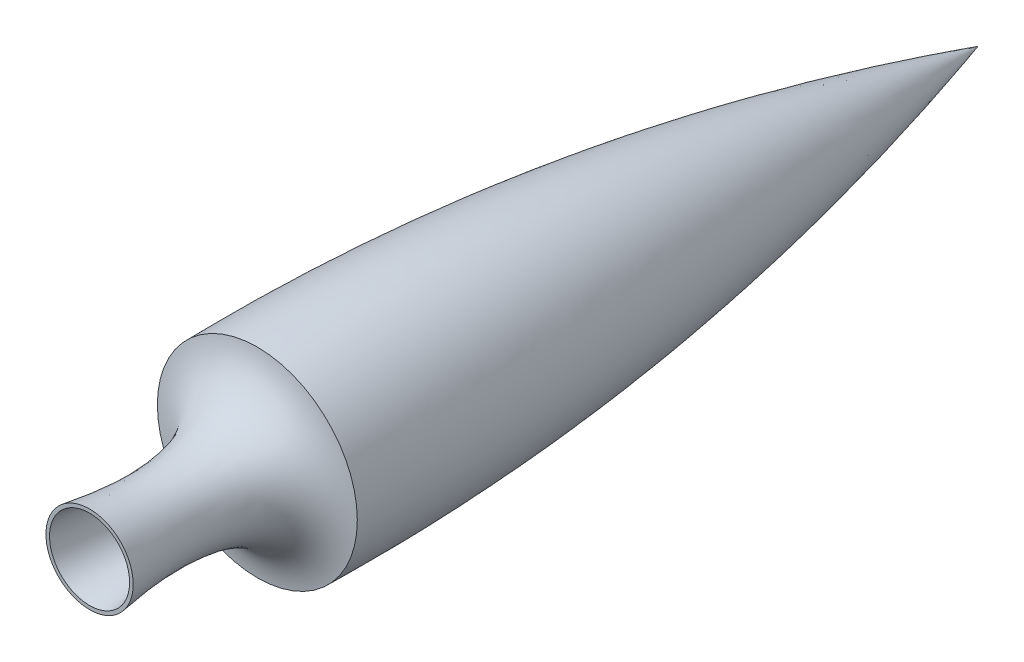
ISO-10303-21;
HEADER;
FILE_DESCRIPTION(('STEP AP214'),'2;1');
FILE_NAME('part.step','',(''),(''),'','','');
FILE_SCHEMA(('AUTOMOTIVE_DESIGN { 1 0 10303 214 1 1 1 1 }'));
ENDSEC;
DATA;
#1=APPLICATION_CONTEXT('core data for automotive mechanical design processes');
#2=APPLICATION_PROTOCOL_DEFINITION('international standard','automotive_design',2000,#1);
#3=PRODUCT_CONTEXT('',#1,'mechanical');
#4=PRODUCT('Part','Part','',(#3));
#5=PRODUCT_RELATED_PRODUCT_CATEGORY('part','',(#4));
#6=PRODUCT_DEFINITION_FORMATION('','',#4);
#7=PRODUCT_DEFINITION_CONTEXT('part definition',#1,'design');
#8=PRODUCT_DEFINITION('design','',#6,#7);
#9=PRODUCT_DEFINITION_SHAPE('','',#8);
#10=(LENGTH_UNIT() NAMED_UNIT(*) SI_UNIT(.MILLI.,.METRE.));
#11=(NAMED_UNIT(*) PLANE_ANGLE_UNIT() SI_UNIT($,.RADIAN.));
#12=(NAMED_UNIT(*) SI_UNIT($,.STERADIAN.) SOLID_ANGLE_UNIT());
#13=UNCERTAINTY_MEASURE_WITH_UNIT(LENGTH_MEASURE(1.E-05),#10,'distance_accuracy_value','');
#14=(GEOMETRIC_REPRESENTATION_CONTEXT(3) GLOBAL_UNCERTAINTY_ASSIGNED_CONTEXT((#13)) GLOBAL_UNIT_ASSIGNED_CONTEXT((#10,
#11,#12)) REPRESENTATION_CONTEXT('',''));
#15=CARTESIAN_POINT('',(0.,0.,0.));
#16=DIRECTION('',(0.,0.,1.));
#17=DIRECTION('',(1.,0.,0.));
#18=AXIS2_PLACEMENT_3D('',#15,#16,#17);
#19=CARTESIAN_POINT('',(2250.27394670477,0.,7226.5861874133));
#20=CARTESIAN_POINT('',(2376.04805744027,0.,-966.497350289462));
#21=CARTESIAN_POINT('',(0.,0.,-8996.49636521877));
#22=B_SPLINE_CURVE_WITH_KNOTS('',2,(#19,#20,#21),.UNSPECIFIED.,.F.,.F.,(3,3),(0.,1.),.UNSPECIFIED.);
#23=CARTESIAN_POINT('',(0.,0.,11003.5036347812));
#24=DIRECTION('',(0.,0.,1.));
#25=AXIS1_PLACEMENT('',#23,#24);
#26=SURFACE_OF_REVOLUTION('',#22,#25);
#27=CARTESIAN_POINT('',(0.,0.,-8996.49636521877));
#28=VERTEX_POINT('',#27);
#29=VERTEX_LOOP('',#28);
#30=FACE_BOUND('',#29,.T.);
#31=CARTESIAN_POINT('',(0.,0.,7226.5861874133));
#32=DIRECTION('',(0.,0.,1.));
#33=DIRECTION('',(1.,0.,0.));
#34=AXIS2_PLACEMENT_3D('',#31,#32,#33);
#35=CIRCLE('',#34,2250.27394670477);
#36=CARTESIAN_POINT('',(2250.27394670477,0.,7226.5861874133));
#37=VERTEX_POINT('',#36);
#38=EDGE_CURVE('E41',#37,#37,#35,.T.);
#39=ORIENTED_EDGE('',*,*,#38,.F.);
#40=EDGE_LOOP('',(#39));
#41=FACE_BOUND('',#40,.T.);
#42=ADVANCED_FACE('F33',(#30,#41),#26,.F.);
#43=CARTESIAN_POINT('',(982.337967225178,0.,11003.5036347812));
#44=DIRECTION('',(0.,0.,1.));
#45=DIRECTION('',(1.,0.,0.));
#46=AXIS2_PLACEMENT_3D('',#43,#44,#45);
#47=PLANE('',#46);
#48=CARTESIAN_POINT('',(0.,0.,11003.5036347812));
#49=DIRECTION('',(0.,0.,1.));
#50=DIRECTION('',(1.,0.,0.));
#51=AXIS2_PLACEMENT_3D('',#48,#49,#50);
#52=CIRCLE('',#51,901.370388322169);
#53=CARTESIAN_POINT('',(901.370388322169,0.,11003.5036347812));
#54=VERTEX_POINT('',#53);
#55=EDGE_CURVE('E57',#54,#54,#52,.T.);
#56=ORIENTED_EDGE('',*,*,#55,.F.);
#57=EDGE_LOOP('',(#56));
#58=FACE_BOUND('',#57,.T.);
#59=CARTESIAN_POINT('',(0.,0.,11003.5036347812));
#60=DIRECTION('',(0.,0.,1.));
#61=DIRECTION('',(1.,0.,0.));
#62=AXIS2_PLACEMENT_3D('',#59,#60,#61);
#63=CIRCLE('',#62,982.337967225178);
#64=CARTESIAN_POINT('',(982.337967225178,0.,11003.5036347812));
#65=VERTEX_POINT('',#64);
#66=EDGE_CURVE('E11',#65,#65,#63,.T.);
#67=ORIENTED_EDGE('',*,*,#66,.T.);
#68=EDGE_LOOP('',(#67));
#69=FACE_BOUND('',#68,.T.);
#70=ADVANCED_FACE('F79',(#58,#69),#47,.T.);
#71=CARTESIAN_POINT('',(982.337967225178,0.,11003.5036347812));
#72=CARTESIAN_POINT('',(428.443970137698,0.,7463.26104752634));
#73=CARTESIAN_POINT('',(2250.27394670477,0.,7226.5861874133));
#74=B_SPLINE_CURVE_WITH_KNOTS('',2,(#71,#72,#73),.UNSPECIFIED.,.F.,.F.,(3,3),(0.,
0.874673003344196),.UNSPECIFIED.);
#75=CARTESIAN_POINT('',(0.,0.,11003.5036347812));
#76=DIRECTION('',(0.,0.,1.));
#77=AXIS1_PLACEMENT('',#75,#76);
#78=SURFACE_OF_REVOLUTION('',#74,#77);
#79=ORIENTED_EDGE('',*,*,#38,.T.);
#80=EDGE_LOOP('',(#79));
#81=FACE_BOUND('',#80,.T.);
#82=ORIENTED_EDGE('',*,*,#66,.F.);
#83=EDGE_LOOP('',(#82));
#84=FACE_BOUND('',#83,.T.);
#85=ADVANCED_FACE('F51',(#81,#84),#78,.F.);
#86=CARTESIAN_POINT('',(2250.27394670477,0.,7226.5861874133));
#87=CARTESIAN_POINT('',(2373.99726459659,0.,-832.906128784835));
#88=CARTESIAN_POINT('',(76.8195171480872,0.,-8734.58886924855));
#89=B_SPLINE_CURVE_WITH_KNOTS('',2,(#86,#87,#88),.UNSPECIFIED.,.F.,.F.,(3,3),(0.,
0.983694634518265),.UNSPECIFIED.);
#90=CARTESIAN_POINT('',(0.,0.,11003.5036347812));
#91=DIRECTION('',(0.,0.,1.));
#92=AXIS1_PLACEMENT('',#90,#91);
#93=SURFACE_OF_REVOLUTION('',#89,#92);
#94=OFFSET_SURFACE('',#93,80.,.F.);
#95=CARTESIAN_POINT('',(9.57567358739198E-13,0.,-8712.25589396233));
#96=VERTEX_POINT('',#95);
#97=VERTEX_LOOP('',#96);
#98=FACE_BOUND('',#97,.T.);
#99=CARTESIAN_POINT('',(0.,0.,7157.43588221838));
#100=DIRECTION('',(0.,0.,1.));
#101=DIRECTION('',(1.,0.,0.));
#102=AXIS2_PLACEMENT_3D('',#99,#100,#101);
#103=CIRCLE('',#102,2171.28305417721);
#104=CARTESIAN_POINT('',(2171.28305417721,0.,7157.43588221838));
#105=VERTEX_POINT('',#104);
#106=EDGE_CURVE('E55',#105,#105,#103,.T.);
#107=ORIENTED_EDGE('',*,*,#106,.T.);
#108=EDGE_LOOP('',(#107));
#109=FACE_BOUND('',#108,.T.);
#110=ADVANCED_FACE('F47',(#98,#109),#94,.T.);
#111=CARTESIAN_POINT('',(982.337967225178,0.,11003.5036347812));
#112=CARTESIAN_POINT('',(428.443970137698,0.,7463.26104752634));
#113=CARTESIAN_POINT('',(2250.27394670477,0.,7226.5861874133));
#114=B_SPLINE_CURVE_WITH_KNOTS('',2,(#111,#112,#113),.UNSPECIFIED.,.F.,.F.,(3,3),(0.,
0.874673003344196),.UNSPECIFIED.);
#115=CARTESIAN_POINT('',(0.,0.,11003.5036347812));
#116=DIRECTION('',(0.,0.,1.));
#117=AXIS1_PLACEMENT('',#115,#116);
#118=SURFACE_OF_REVOLUTION('',#114,#117);
#119=OFFSET_SURFACE('',#118,80.,.F.);
#120=ORIENTED_EDGE('',*,*,#106,.F.);
#121=EDGE_LOOP('',(#120));
#122=FACE_BOUND('',#121,.T.);
#123=ORIENTED_EDGE('',*,*,#55,.T.);
#124=EDGE_LOOP('',(#123));
#125=FACE_BOUND('',#124,.T.);
#126=ADVANCED_FACE('F50',(#122,#125),#119,.T.);
#127=CLOSED_SHELL('',(#42,#70,#85,#110,#126));
#128=MANIFOLD_SOLID_BREP('B2',#127);
#129=ADVANCED_BREP_SHAPE_REPRESENTATION('',(#18,#128),#14);
#130=SHAPE_DEFINITION_REPRESENTATION(#9,#129);
ENDSEC;
END-ISO-10303-21;
